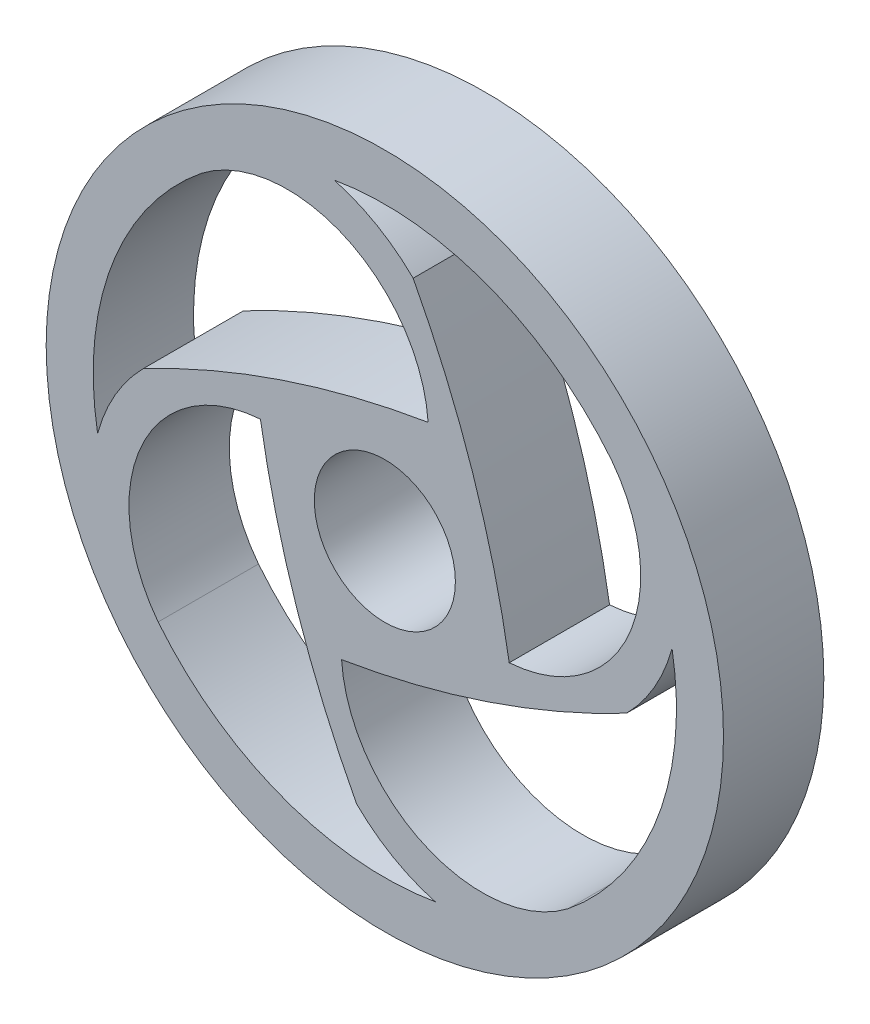
ISO-10303-21;
HEADER;
FILE_DESCRIPTION(('STEP AP214'),'2;1');
FILE_NAME('part.step','',(''),(''),'','','');
FILE_SCHEMA(('AUTOMOTIVE_DESIGN { 1 0 10303 214 1 1 1 1 }'));
ENDSEC;
DATA;
#1=APPLICATION_CONTEXT('core data for automotive mechanical design processes');
#2=APPLICATION_PROTOCOL_DEFINITION('international standard','automotive_design',2000,#1);
#3=PRODUCT_CONTEXT('',#1,'mechanical');
#4=PRODUCT('Part','Part','',(#3));
#5=PRODUCT_RELATED_PRODUCT_CATEGORY('part','',(#4));
#6=PRODUCT_DEFINITION_FORMATION('','',#4);
#7=PRODUCT_DEFINITION_CONTEXT('part definition',#1,'design');
#8=PRODUCT_DEFINITION('design','',#6,#7);
#9=PRODUCT_DEFINITION_SHAPE('','',#8);
#10=(LENGTH_UNIT() NAMED_UNIT(*) SI_UNIT(.MILLI.,.METRE.));
#11=(NAMED_UNIT(*) PLANE_ANGLE_UNIT() SI_UNIT($,.RADIAN.));
#12=(NAMED_UNIT(*) SI_UNIT($,.STERADIAN.) SOLID_ANGLE_UNIT());
#13=UNCERTAINTY_MEASURE_WITH_UNIT(LENGTH_MEASURE(1.E-05),#10,'distance_accuracy_value','');
#14=(GEOMETRIC_REPRESENTATION_CONTEXT(3) GLOBAL_UNCERTAINTY_ASSIGNED_CONTEXT((#13)) GLOBAL_UNIT_ASSIGNED_CONTEXT((#10,
#11,#12)) REPRESENTATION_CONTEXT('',''));
#15=CARTESIAN_POINT('',(0.,0.,0.));
#16=DIRECTION('',(0.,0.,1.));
#17=DIRECTION('',(1.,0.,0.));
#18=AXIS2_PLACEMENT_3D('',#15,#16,#17);
#19=CARTESIAN_POINT('',(-31.0957118066242,36.602722618068,32.));
#20=DIRECTION('',(0.,0.,-1.));
#21=DIRECTION('',(-1.,0.,0.));
#22=AXIS2_PLACEMENT_3D('',#19,#20,#21);
#23=CYLINDRICAL_SURFACE('',#22,45.);
#24=CARTESIAN_POINT('',(-31.0957118066242,36.602722618068,0.));
#25=DIRECTION('',(0.,0.,1.));
#26=DIRECTION('',(1.,0.,0.));
#27=AXIS2_PLACEMENT_3D('',#24,#25,#26);
#28=CIRCLE('',#27,45.);
#29=CARTESIAN_POINT('',(13.799753366446,39.6682090221535,0.));
#30=VERTEX_POINT('',#29);
#31=CARTESIAN_POINT('',(-58.5081427307582,72.2896758479192,0.));
#32=VERTEX_POINT('',#31);
#33=EDGE_CURVE('E248',#30,#32,#28,.T.);
#34=ORIENTED_EDGE('',*,*,#33,.F.);
#35=DIRECTION('',(0.,0.,-1.));
#36=VECTOR('',#35,1.);
#37=CARTESIAN_POINT('',(13.799753366446,39.6682090221535,32.));
#38=LINE('',#37,#36);
#39=CARTESIAN_POINT('',(13.799753366446,39.6682090221535,32.));
#40=VERTEX_POINT('',#39);
#41=EDGE_CURVE('E11',#40,#30,#38,.T.);
#42=ORIENTED_EDGE('',*,*,#41,.F.);
#43=CARTESIAN_POINT('',(-31.0957118066242,36.602722618068,32.));
#44=DIRECTION('',(0.,0.,1.));
#45=DIRECTION('',(1.,0.,0.));
#46=AXIS2_PLACEMENT_3D('',#43,#44,#45);
#47=CIRCLE('',#46,45.);
#48=CARTESIAN_POINT('',(-58.5081427307582,72.2896758479192,32.));
#49=VERTEX_POINT('',#48);
#50=EDGE_CURVE('E181',#40,#49,#47,.T.);
#51=ORIENTED_EDGE('',*,*,#50,.T.);
#52=DIRECTION('',(0.,0.,-1.));
#53=VECTOR('',#52,1.);
#54=CARTESIAN_POINT('',(-58.5081427307582,72.2896758479192,32.));
#55=LINE('',#54,#53);
#56=EDGE_CURVE('E59',#49,#32,#55,.T.);
#57=ORIENTED_EDGE('',*,*,#56,.T.);
#58=EDGE_LOOP('',(#34,#42,#51,#57));
#59=FACE_BOUND('',#58,.T.);
#60=ADVANCED_FACE('F39',(#59),#23,.F.);
#61=CARTESIAN_POINT('',(62.9548606400824,-256.277352574768,32.));
#62=DIRECTION('',(0.,0.,-1.));
#63=DIRECTION('',(-1.,0.,0.));
#64=AXIS2_PLACEMENT_3D('',#61,#62,#63);
#65=CYLINDRICAL_SURFACE('',#64,300.);
#66=CARTESIAN_POINT('',(62.9548606400824,-256.277352574768,0.));
#67=DIRECTION('',(0.,0.,1.));
#68=DIRECTION('',(1.,0.,0.));
#69=AXIS2_PLACEMENT_3D('',#66,#67,#68);
#70=CIRCLE('',#69,300.);
#71=CARTESIAN_POINT('',(-77.0845985108538,9.03180648445714,0.));
#72=VERTEX_POINT('',#71);
#73=EDGE_CURVE('E166',#72,#30,#70,.F.);
#74=ORIENTED_EDGE('',*,*,#73,.F.);
#75=DIRECTION('',(0.,0.,-1.));
#76=VECTOR('',#75,1.);
#77=CARTESIAN_POINT('',(-77.0845985108538,9.03180648445714,32.));
#78=LINE('',#77,#76);
#79=CARTESIAN_POINT('',(-77.0845985108538,9.03180648445714,32.));
#80=VERTEX_POINT('',#79);
#81=EDGE_CURVE('E50',#80,#72,#78,.T.);
#82=ORIENTED_EDGE('',*,*,#81,.F.);
#83=CARTESIAN_POINT('',(62.9548606400824,-256.277352574768,32.));
#84=DIRECTION('',(0.,0.,1.));
#85=DIRECTION('',(1.,0.,0.));
#86=AXIS2_PLACEMENT_3D('',#83,#84,#85);
#87=CIRCLE('',#86,300.);
#88=EDGE_CURVE('E164',#80,#40,#87,.F.);
#89=ORIENTED_EDGE('',*,*,#88,.T.);
#90=ORIENTED_EDGE('',*,*,#41,.T.);
#91=EDGE_LOOP('',(#74,#82,#89,#90));
#92=FACE_BOUND('',#91,.T.);
#93=ADVANCED_FACE('F162',(#92),#65,.T.);
#94=CARTESIAN_POINT('',(-36.6027226180679,-31.0957118066244,32.));
#95=DIRECTION('',(0.,0.,-1.));
#96=DIRECTION('',(-1.,0.,0.));
#97=AXIS2_PLACEMENT_3D('',#94,#95,#96);
#98=CYLINDRICAL_SURFACE('',#97,57.);
#99=CARTESIAN_POINT('',(-36.6027226180679,-31.0957118066244,0.));
#100=DIRECTION('',(0.,0.,1.));
#101=DIRECTION('',(1.,0.,0.));
#102=AXIS2_PLACEMENT_3D('',#99,#100,#101);
#103=CIRCLE('',#102,57.);
#104=CARTESIAN_POINT('',(-91.5954062888451,-16.1022217964289,0.));
#105=VERTEX_POINT('',#104);
#106=EDGE_CURVE('E253',#72,#105,#103,.T.);
#107=ORIENTED_EDGE('',*,*,#106,.T.);
#108=DIRECTION('',(0.,0.,-1.));
#109=VECTOR('',#108,1.);
#110=CARTESIAN_POINT('',(-91.5954062888451,-16.1022217964289,32.));
#111=LINE('',#110,#109);
#112=CARTESIAN_POINT('',(-91.5954062888451,-16.1022217964289,32.));
#113=VERTEX_POINT('',#112);
#114=EDGE_CURVE('E109',#113,#105,#111,.T.);
#115=ORIENTED_EDGE('',*,*,#114,.F.);
#116=CARTESIAN_POINT('',(-36.6027226180679,-31.0957118066244,32.));
#117=DIRECTION('',(0.,0.,1.));
#118=DIRECTION('',(1.,0.,0.));
#119=AXIS2_PLACEMENT_3D('',#116,#117,#118);
#120=CIRCLE('',#119,57.);
#121=EDGE_CURVE('E171',#80,#113,#120,.T.);
#122=ORIENTED_EDGE('',*,*,#121,.F.);
#123=ORIENTED_EDGE('',*,*,#81,.T.);
#124=EDGE_LOOP('',(#107,#115,#122,#123));
#125=FACE_BOUND('',#124,.T.);
#126=ADVANCED_FACE('F172',(#125),#98,.T.);
#127=CARTESIAN_POINT('',(0.,0.,32.));
#128=DIRECTION('',(0.,0.,-1.));
#129=DIRECTION('',(-1.,0.,0.));
#130=AXIS2_PLACEMENT_3D('',#127,#128,#129);
#131=CYLINDRICAL_SURFACE('',#130,93.);
#132=CARTESIAN_POINT('',(0.,0.,0.));
#133=DIRECTION('',(0.,0.,1.));
#134=DIRECTION('',(1.,0.,0.));
#135=AXIS2_PLACEMENT_3D('',#132,#133,#134);
#136=CIRCLE('',#135,93.);
#137=CARTESIAN_POINT('',(72.2896758479186,58.5081427307589,0.));
#138=VERTEX_POINT('',#137);
#139=CARTESIAN_POINT('',(-16.1022217964286,91.5954062888452,0.));
#140=VERTEX_POINT('',#139);
#141=EDGE_CURVE('E232',#138,#140,#136,.T.);
#142=ORIENTED_EDGE('',*,*,#141,.F.);
#143=DIRECTION('',(0.,0.,-1.));
#144=VECTOR('',#143,1.);
#145=CARTESIAN_POINT('',(72.2896758479186,58.5081427307589,32.));
#146=LINE('',#145,#144);
#147=CARTESIAN_POINT('',(72.2896758479186,58.5081427307589,32.));
#148=VERTEX_POINT('',#147);
#149=EDGE_CURVE('E271',#148,#138,#146,.T.);
#150=ORIENTED_EDGE('',*,*,#149,.F.);
#151=CARTESIAN_POINT('',(0.,0.,32.));
#152=DIRECTION('',(0.,0.,1.));
#153=DIRECTION('',(1.,0.,0.));
#154=AXIS2_PLACEMENT_3D('',#151,#152,#153);
#155=CIRCLE('',#154,93.);
#156=CARTESIAN_POINT('',(-16.1022217964286,91.5954062888452,32.));
#157=VERTEX_POINT('',#156);
#158=EDGE_CURVE('E350',#148,#157,#155,.T.);
#159=ORIENTED_EDGE('',*,*,#158,.T.);
#160=DIRECTION('',(0.,0.,-1.));
#161=VECTOR('',#160,1.);
#162=CARTESIAN_POINT('',(-16.1022217964286,91.5954062888452,32.));
#163=LINE('',#162,#161);
#164=EDGE_CURVE('E274',#157,#140,#163,.T.);
#165=ORIENTED_EDGE('',*,*,#164,.T.);
#166=EDGE_LOOP('',(#142,#150,#159,#165));
#167=FACE_BOUND('',#166,.T.);
#168=ADVANCED_FACE('F373',(#167),#131,.F.);
#169=CARTESIAN_POINT('',(36.6027226180677,31.0957118066246,32.));
#170=DIRECTION('',(0.,0.,-1.));
#171=DIRECTION('',(-1.,0.,0.));
#172=AXIS2_PLACEMENT_3D('',#169,#170,#171);
#173=CYLINDRICAL_SURFACE('',#172,45.);
#174=CARTESIAN_POINT('',(36.6027226180677,31.0957118066246,0.));
#175=DIRECTION('',(0.,0.,1.));
#176=DIRECTION('',(1.,0.,0.));
#177=AXIS2_PLACEMENT_3D('',#174,#175,#176);
#178=CIRCLE('',#177,45.);
#179=CARTESIAN_POINT('',(39.6682090221536,-13.7997533664457,0.));
#180=VERTEX_POINT('',#179);
#181=EDGE_CURVE('E236',#180,#138,#178,.T.);
#182=ORIENTED_EDGE('',*,*,#181,.F.);
#183=DIRECTION('',(0.,0.,-1.));
#184=VECTOR('',#183,1.);
#185=CARTESIAN_POINT('',(39.6682090221536,-13.7997533664457,32.));
#186=LINE('',#185,#184);
#187=CARTESIAN_POINT('',(39.6682090221536,-13.7997533664457,32.));
#188=VERTEX_POINT('',#187);
#189=EDGE_CURVE('E281',#188,#180,#186,.T.);
#190=ORIENTED_EDGE('',*,*,#189,.F.);
#191=CARTESIAN_POINT('',(36.6027226180677,31.0957118066246,32.));
#192=DIRECTION('',(0.,0.,1.));
#193=DIRECTION('',(1.,0.,0.));
#194=AXIS2_PLACEMENT_3D('',#191,#192,#193);
#195=CIRCLE('',#194,45.);
#196=EDGE_CURVE('E354',#188,#148,#195,.T.);
#197=ORIENTED_EDGE('',*,*,#196,.T.);
#198=ORIENTED_EDGE('',*,*,#149,.T.);
#199=EDGE_LOOP('',(#182,#190,#197,#198));
#200=FACE_BOUND('',#199,.T.);
#201=ADVANCED_FACE('F376',(#200),#173,.F.);
#202=CARTESIAN_POINT('',(-256.277352574767,-62.9548606400851,32.));
#203=DIRECTION('',(0.,0.,-1.));
#204=DIRECTION('',(-1.,0.,0.));
#205=AXIS2_PLACEMENT_3D('',#202,#203,#204);
#206=CYLINDRICAL_SURFACE('',#205,300.);
#207=CARTESIAN_POINT('',(-256.277352574767,-62.9548606400851,0.));
#208=DIRECTION('',(0.,0.,1.));
#209=DIRECTION('',(1.,0.,0.));
#210=AXIS2_PLACEMENT_3D('',#207,#208,#209);
#211=CIRCLE('',#210,300.);
#212=CARTESIAN_POINT('',(9.03180648445528,77.0845985108558,0.));
#213=VERTEX_POINT('',#212);
#214=EDGE_CURVE('E240',#213,#180,#211,.F.);
#215=ORIENTED_EDGE('',*,*,#214,.F.);
#216=DIRECTION('',(0.,0.,-1.));
#217=VECTOR('',#216,1.);
#218=CARTESIAN_POINT('',(9.03180648445528,77.0845985108558,32.));
#219=LINE('',#218,#217);
#220=CARTESIAN_POINT('',(9.03180648445528,77.0845985108558,32.));
#221=VERTEX_POINT('',#220);
#222=EDGE_CURVE('E277',#221,#213,#219,.T.);
#223=ORIENTED_EDGE('',*,*,#222,.F.);
#224=CARTESIAN_POINT('',(-256.277352574767,-62.9548606400851,32.));
#225=DIRECTION('',(0.,0.,1.));
#226=DIRECTION('',(1.,0.,0.));
#227=AXIS2_PLACEMENT_3D('',#224,#225,#226);
#228=CIRCLE('',#227,300.);
#229=EDGE_CURVE('E358',#221,#188,#228,.F.);
#230=ORIENTED_EDGE('',*,*,#229,.T.);
#231=ORIENTED_EDGE('',*,*,#189,.T.);
#232=EDGE_LOOP('',(#215,#223,#230,#231));
#233=FACE_BOUND('',#232,.T.);
#234=ADVANCED_FACE('F379',(#233),#206,.T.);
#235=CARTESIAN_POINT('',(0.,0.,32.));
#236=DIRECTION('',(0.,0.,-1.));
#237=DIRECTION('',(-1.,0.,0.));
#238=AXIS2_PLACEMENT_3D('',#235,#236,#237);
#239=CYLINDRICAL_SURFACE('',#238,93.);
#240=CARTESIAN_POINT('',(0.,0.,0.));
#241=DIRECTION('',(0.,0.,1.));
#242=DIRECTION('',(1.,0.,0.));
#243=AXIS2_PLACEMENT_3D('',#240,#241,#242);
#244=CIRCLE('',#243,93.);
#245=CARTESIAN_POINT('',(58.5081427307587,-72.2896758479188,0.));
#246=VERTEX_POINT('',#245);
#247=CARTESIAN_POINT('',(91.595406288845,16.1022217964296,0.));
#248=VERTEX_POINT('',#247);
#249=EDGE_CURVE('E216',#246,#248,#244,.T.);
#250=ORIENTED_EDGE('',*,*,#249,.F.);
#251=DIRECTION('',(0.,0.,-1.));
#252=VECTOR('',#251,1.);
#253=CARTESIAN_POINT('',(58.5081427307587,-72.2896758479188,32.));
#254=LINE('',#253,#252);
#255=CARTESIAN_POINT('',(58.5081427307587,-72.2896758479188,32.));
#256=VERTEX_POINT('',#255);
#257=EDGE_CURVE('E278',#256,#246,#254,.T.);
#258=ORIENTED_EDGE('',*,*,#257,.F.);
#259=CARTESIAN_POINT('',(0.,0.,32.));
#260=DIRECTION('',(0.,0.,1.));
#261=DIRECTION('',(1.,0.,0.));
#262=AXIS2_PLACEMENT_3D('',#259,#260,#261);
#263=CIRCLE('',#262,93.);
#264=CARTESIAN_POINT('',(91.595406288845,16.1022217964296,32.));
#265=VERTEX_POINT('',#264);
#266=EDGE_CURVE('E327',#256,#265,#263,.T.);
#267=ORIENTED_EDGE('',*,*,#266,.T.);
#268=DIRECTION('',(0.,0.,-1.));
#269=VECTOR('',#268,1.);
#270=CARTESIAN_POINT('',(91.595406288845,16.1022217964296,32.));
#271=LINE('',#270,#269);
#272=EDGE_CURVE('E286',#265,#248,#271,.T.);
#273=ORIENTED_EDGE('',*,*,#272,.T.);
#274=EDGE_LOOP('',(#250,#258,#267,#273));
#275=FACE_BOUND('',#274,.T.);
#276=ADVANCED_FACE('F415',(#275),#239,.F.);
#277=CARTESIAN_POINT('',(31.0957118066245,-36.6027226180678,32.));
#278=DIRECTION('',(0.,0.,-1.));
#279=DIRECTION('',(-1.,0.,0.));
#280=AXIS2_PLACEMENT_3D('',#277,#278,#279);
#281=CYLINDRICAL_SURFACE('',#280,45.);
#282=CARTESIAN_POINT('',(31.0957118066245,-36.6027226180678,0.));
#283=DIRECTION('',(0.,0.,1.));
#284=DIRECTION('',(1.,0.,0.));
#285=AXIS2_PLACEMENT_3D('',#282,#283,#284);
#286=CIRCLE('',#285,45.);
#287=CARTESIAN_POINT('',(-13.7997533664455,-39.6682090221536,0.));
#288=VERTEX_POINT('',#287);
#289=EDGE_CURVE('E220',#288,#246,#286,.T.);
#290=ORIENTED_EDGE('',*,*,#289,.F.);
#291=DIRECTION('',(0.,0.,-1.));
#292=VECTOR('',#291,1.);
#293=CARTESIAN_POINT('',(-13.7997533664455,-39.6682090221536,32.));
#294=LINE('',#293,#292);
#295=CARTESIAN_POINT('',(-13.7997533664455,-39.6682090221536,32.));
#296=VERTEX_POINT('',#295);
#297=EDGE_CURVE('E292',#296,#288,#294,.T.);
#298=ORIENTED_EDGE('',*,*,#297,.F.);
#299=CARTESIAN_POINT('',(31.0957118066245,-36.6027226180678,32.));
#300=DIRECTION('',(0.,0.,1.));
#301=DIRECTION('',(1.,0.,0.));
#302=AXIS2_PLACEMENT_3D('',#299,#300,#301);
#303=CIRCLE('',#302,45.);
#304=EDGE_CURVE('E339',#296,#256,#303,.T.);
#305=ORIENTED_EDGE('',*,*,#304,.T.);
#306=ORIENTED_EDGE('',*,*,#257,.T.);
#307=EDGE_LOOP('',(#290,#298,#305,#306));
#308=FACE_BOUND('',#307,.T.);
#309=ADVANCED_FACE('F426',(#308),#281,.F.);
#310=CARTESIAN_POINT('',(-62.9548606400842,256.277352574768,32.));
#311=DIRECTION('',(0.,0.,-1.));
#312=DIRECTION('',(-1.,0.,0.));
#313=AXIS2_PLACEMENT_3D('',#310,#311,#312);
#314=CYLINDRICAL_SURFACE('',#313,300.);
#315=CARTESIAN_POINT('',(-62.9548606400842,256.277352574768,0.));
#316=DIRECTION('',(0.,0.,1.));
#317=DIRECTION('',(1.,0.,0.));
#318=AXIS2_PLACEMENT_3D('',#315,#316,#317);
#319=CIRCLE('',#318,300.);
#320=CARTESIAN_POINT('',(77.0845985108537,-9.03180648445678,0.));
#321=VERTEX_POINT('',#320);
#322=EDGE_CURVE('E224',#321,#288,#319,.F.);
#323=ORIENTED_EDGE('',*,*,#322,.F.);
#324=DIRECTION('',(0.,0.,-1.));
#325=VECTOR('',#324,1.);
#326=CARTESIAN_POINT('',(77.0845985108537,-9.03180648445678,32.));
#327=LINE('',#326,#325);
#328=CARTESIAN_POINT('',(77.0845985108537,-9.03180648445678,32.));
#329=VERTEX_POINT('',#328);
#330=EDGE_CURVE('E289',#329,#321,#327,.T.);
#331=ORIENTED_EDGE('',*,*,#330,.F.);
#332=CARTESIAN_POINT('',(-62.9548606400842,256.277352574768,32.));
#333=DIRECTION('',(0.,0.,1.));
#334=DIRECTION('',(1.,0.,0.));
#335=AXIS2_PLACEMENT_3D('',#332,#333,#334);
#336=CIRCLE('',#335,300.);
#337=EDGE_CURVE('E343',#329,#296,#336,.F.);
#338=ORIENTED_EDGE('',*,*,#337,.T.);
#339=ORIENTED_EDGE('',*,*,#297,.T.);
#340=EDGE_LOOP('',(#323,#331,#338,#339));
#341=FACE_BOUND('',#340,.T.);
#342=ADVANCED_FACE('F423',(#341),#314,.T.);
#343=CARTESIAN_POINT('',(0.,0.,32.));
#344=DIRECTION('',(0.,0.,-1.));
#345=DIRECTION('',(-1.,0.,0.));
#346=AXIS2_PLACEMENT_3D('',#343,#344,#345);
#347=CYLINDRICAL_SURFACE('',#346,93.);
#348=CARTESIAN_POINT('',(0.,0.,0.));
#349=DIRECTION('',(0.,0.,1.));
#350=DIRECTION('',(1.,0.,0.));
#351=AXIS2_PLACEMENT_3D('',#348,#349,#350);
#352=CIRCLE('',#351,93.);
#353=CARTESIAN_POINT('',(-72.289675847919,-58.5081427307584,0.));
#354=VERTEX_POINT('',#353);
#355=CARTESIAN_POINT('',(16.1022217964292,-91.5954062888451,0.));
#356=VERTEX_POINT('',#355);
#357=EDGE_CURVE('E200',#354,#356,#352,.T.);
#358=ORIENTED_EDGE('',*,*,#357,.F.);
#359=DIRECTION('',(0.,0.,-1.));
#360=VECTOR('',#359,1.);
#361=CARTESIAN_POINT('',(-72.289675847919,-58.5081427307584,32.));
#362=LINE('',#361,#360);
#363=CARTESIAN_POINT('',(-72.289675847919,-58.5081427307584,32.));
#364=VERTEX_POINT('',#363);
#365=EDGE_CURVE('E43',#364,#354,#362,.T.);
#366=ORIENTED_EDGE('',*,*,#365,.F.);
#367=CARTESIAN_POINT('',(0.,0.,32.));
#368=DIRECTION('',(0.,0.,1.));
#369=DIRECTION('',(1.,0.,0.));
#370=AXIS2_PLACEMENT_3D('',#367,#368,#369);
#371=CIRCLE('',#370,93.);
#372=CARTESIAN_POINT('',(16.1022217964292,-91.5954062888451,32.));
#373=VERTEX_POINT('',#372);
#374=EDGE_CURVE('E268',#364,#373,#371,.T.);
#375=ORIENTED_EDGE('',*,*,#374,.T.);
#376=DIRECTION('',(0.,0.,-1.));
#377=VECTOR('',#376,1.);
#378=CARTESIAN_POINT('',(16.1022217964292,-91.5954062888451,32.));
#379=LINE('',#378,#377);
#380=EDGE_CURVE('E199',#373,#356,#379,.T.);
#381=ORIENTED_EDGE('',*,*,#380,.T.);
#382=EDGE_LOOP('',(#358,#366,#375,#381));
#383=FACE_BOUND('',#382,.T.);
#384=ADVANCED_FACE('F41',(#383),#347,.F.);
#385=CARTESIAN_POINT('',(-36.6027226180679,-31.0957118066244,32.));
#386=DIRECTION('',(0.,0.,-1.));
#387=DIRECTION('',(-1.,0.,0.));
#388=AXIS2_PLACEMENT_3D('',#385,#386,#387);
#389=CYLINDRICAL_SURFACE('',#388,45.);
#390=CARTESIAN_POINT('',(-36.6027226180679,-31.0957118066244,0.));
#391=DIRECTION('',(0.,0.,1.));
#392=DIRECTION('',(1.,0.,0.));
#393=AXIS2_PLACEMENT_3D('',#390,#391,#392);
#394=CIRCLE('',#393,45.);
#395=CARTESIAN_POINT('',(-39.6682090221537,13.7997533664459,0.));
#396=VERTEX_POINT('',#395);
#397=EDGE_CURVE('E204',#396,#354,#394,.T.);
#398=ORIENTED_EDGE('',*,*,#397,.F.);
#399=DIRECTION('',(0.,0.,-1.));
#400=VECTOR('',#399,1.);
#401=CARTESIAN_POINT('',(-39.6682090221537,13.7997533664459,32.));
#402=LINE('',#401,#400);
#403=CARTESIAN_POINT('',(-39.6682090221537,13.7997533664459,32.));
#404=VERTEX_POINT('',#403);
#405=EDGE_CURVE('E301',#404,#396,#402,.T.);
#406=ORIENTED_EDGE('',*,*,#405,.F.);
#407=CARTESIAN_POINT('',(-36.6027226180679,-31.0957118066244,32.));
#408=DIRECTION('',(0.,0.,1.));
#409=DIRECTION('',(1.,0.,0.));
#410=AXIS2_PLACEMENT_3D('',#407,#408,#409);
#411=CIRCLE('',#410,45.);
#412=EDGE_CURVE('E312',#404,#364,#411,.T.);
#413=ORIENTED_EDGE('',*,*,#412,.T.);
#414=ORIENTED_EDGE('',*,*,#365,.T.);
#415=EDGE_LOOP('',(#398,#406,#413,#414));
#416=FACE_BOUND('',#415,.T.);
#417=ADVANCED_FACE('F310',(#416),#389,.F.);
#418=CARTESIAN_POINT('',(256.277352574768,62.9548606400833,32.));
#419=DIRECTION('',(0.,0.,-1.));
#420=DIRECTION('',(-1.,0.,0.));
#421=AXIS2_PLACEMENT_3D('',#418,#419,#420);
#422=CYLINDRICAL_SURFACE('',#421,300.);
#423=CARTESIAN_POINT('',(256.277352574768,62.9548606400833,0.));
#424=DIRECTION('',(0.,0.,1.));
#425=DIRECTION('',(1.,0.,0.));
#426=AXIS2_PLACEMENT_3D('',#423,#424,#425);
#427=CIRCLE('',#426,300.);
#428=CARTESIAN_POINT('',(-9.03180648445713,-77.0845985108535,0.));
#429=VERTEX_POINT('',#428);
#430=EDGE_CURVE('E208',#429,#396,#427,.F.);
#431=ORIENTED_EDGE('',*,*,#430,.F.);
#432=DIRECTION('',(0.,0.,-1.));
#433=VECTOR('',#432,1.);
#434=CARTESIAN_POINT('',(-9.03180648445713,-77.0845985108535,32.));
#435=LINE('',#434,#433);
#436=CARTESIAN_POINT('',(-9.03180648445713,-77.0845985108535,32.));
#437=VERTEX_POINT('',#436);
#438=EDGE_CURVE('E299',#437,#429,#435,.T.);
#439=ORIENTED_EDGE('',*,*,#438,.F.);
#440=CARTESIAN_POINT('',(256.277352574768,62.9548606400833,32.));
#441=DIRECTION('',(0.,0.,1.));
#442=DIRECTION('',(1.,0.,0.));
#443=AXIS2_PLACEMENT_3D('',#440,#441,#442);
#444=CIRCLE('',#443,300.);
#445=EDGE_CURVE('E321',#437,#404,#444,.F.);
#446=ORIENTED_EDGE('',*,*,#445,.T.);
#447=ORIENTED_EDGE('',*,*,#405,.T.);
#448=EDGE_LOOP('',(#431,#439,#446,#447));
#449=FACE_BOUND('',#448,.T.);
#450=ADVANCED_FACE('F318',(#449),#422,.T.);
#451=CARTESIAN_POINT('',(0.,0.,32.));
#452=DIRECTION('',(0.,0.,-1.));
#453=DIRECTION('',(-1.,0.,0.));
#454=AXIS2_PLACEMENT_3D('',#451,#452,#453);
#455=CYLINDRICAL_SURFACE('',#454,22.5);
#456=CARTESIAN_POINT('',(0.,0.,32.));
#457=DIRECTION('',(0.,0.,1.));
#458=DIRECTION('',(1.,0.,0.));
#459=AXIS2_PLACEMENT_3D('',#456,#457,#458);
#460=CIRCLE('',#459,22.5);
#461=CARTESIAN_POINT('',(22.5,0.,32.));
#462=VERTEX_POINT('',#461);
#463=EDGE_CURVE('E191',#462,#462,#460,.T.);
#464=ORIENTED_EDGE('',*,*,#463,.T.);
#465=EDGE_LOOP('',(#464));
#466=FACE_BOUND('',#465,.T.);
#467=CARTESIAN_POINT('',(0.,0.,0.));
#468=DIRECTION('',(0.,0.,1.));
#469=DIRECTION('',(1.,0.,0.));
#470=AXIS2_PLACEMENT_3D('',#467,#468,#469);
#471=CIRCLE('',#470,22.5);
#472=CARTESIAN_POINT('',(22.5,0.,0.));
#473=VERTEX_POINT('',#472);
#474=EDGE_CURVE('E260',#473,#473,#471,.T.);
#475=ORIENTED_EDGE('',*,*,#474,.F.);
#476=EDGE_LOOP('',(#475));
#477=FACE_BOUND('',#476,.T.);
#478=ADVANCED_FACE('F435',(#466,#477),#455,.F.);
#479=CARTESIAN_POINT('',(0.,0.,32.));
#480=DIRECTION('',(0.,0.,-1.));
#481=DIRECTION('',(-1.,0.,0.));
#482=AXIS2_PLACEMENT_3D('',#479,#480,#481);
#483=CYLINDRICAL_SURFACE('',#482,93.);
#484=CARTESIAN_POINT('',(0.,0.,0.));
#485=DIRECTION('',(0.,0.,1.));
#486=DIRECTION('',(1.,0.,0.));
#487=AXIS2_PLACEMENT_3D('',#484,#485,#486);
#488=CIRCLE('',#487,93.);
#489=EDGE_CURVE('E256',#32,#105,#488,.T.);
#490=ORIENTED_EDGE('',*,*,#489,.F.);
#491=ORIENTED_EDGE('',*,*,#56,.F.);
#492=CARTESIAN_POINT('',(0.,0.,32.));
#493=DIRECTION('',(0.,0.,1.));
#494=DIRECTION('',(1.,0.,0.));
#495=AXIS2_PLACEMENT_3D('',#492,#493,#494);
#496=CIRCLE('',#495,93.);
#497=EDGE_CURVE('E176',#49,#113,#496,.T.);
#498=ORIENTED_EDGE('',*,*,#497,.T.);
#499=ORIENTED_EDGE('',*,*,#114,.T.);
#500=EDGE_LOOP('',(#490,#491,#498,#499));
#501=FACE_BOUND('',#500,.T.);
#502=ADVANCED_FACE('F412',(#501),#483,.F.);
#503=CARTESIAN_POINT('',(-31.0957118066242,36.602722618068,32.));
#504=DIRECTION('',(0.,0.,-1.));
#505=DIRECTION('',(-1.,0.,0.));
#506=AXIS2_PLACEMENT_3D('',#503,#504,#505);
#507=CYLINDRICAL_SURFACE('',#506,57.);
#508=CARTESIAN_POINT('',(-31.0957118066242,36.602722618068,0.));
#509=DIRECTION('',(0.,0.,1.));
#510=DIRECTION('',(1.,0.,0.));
#511=AXIS2_PLACEMENT_3D('',#508,#509,#510);
#512=CIRCLE('',#511,57.);
#513=EDGE_CURVE('E244',#213,#140,#512,.T.);
#514=ORIENTED_EDGE('',*,*,#513,.T.);
#515=ORIENTED_EDGE('',*,*,#164,.F.);
#516=CARTESIAN_POINT('',(-31.0957118066242,36.602722618068,32.));
#517=DIRECTION('',(0.,0.,1.));
#518=DIRECTION('',(1.,0.,0.));
#519=AXIS2_PLACEMENT_3D('',#516,#517,#518);
#520=CIRCLE('',#519,57.);
#521=EDGE_CURVE('E185',#221,#157,#520,.T.);
#522=ORIENTED_EDGE('',*,*,#521,.F.);
#523=ORIENTED_EDGE('',*,*,#222,.T.);
#524=EDGE_LOOP('',(#514,#515,#522,#523));
#525=FACE_BOUND('',#524,.T.);
#526=ADVANCED_FACE('F369',(#525),#507,.T.);
#527=CARTESIAN_POINT('',(36.6027226180677,31.0957118066246,32.));
#528=DIRECTION('',(0.,0.,-1.));
#529=DIRECTION('',(-1.,0.,0.));
#530=AXIS2_PLACEMENT_3D('',#527,#528,#529);
#531=CYLINDRICAL_SURFACE('',#530,57.);
#532=CARTESIAN_POINT('',(36.6027226180677,31.0957118066246,0.));
#533=DIRECTION('',(0.,0.,1.));
#534=DIRECTION('',(1.,0.,0.));
#535=AXIS2_PLACEMENT_3D('',#532,#533,#534);
#536=CIRCLE('',#535,57.);
#537=EDGE_CURVE('E228',#321,#248,#536,.T.);
#538=ORIENTED_EDGE('',*,*,#537,.T.);
#539=ORIENTED_EDGE('',*,*,#272,.F.);
#540=CARTESIAN_POINT('',(36.6027226180677,31.0957118066246,32.));
#541=DIRECTION('',(0.,0.,1.));
#542=DIRECTION('',(1.,0.,0.));
#543=AXIS2_PLACEMENT_3D('',#540,#541,#542);
#544=CIRCLE('',#543,57.);
#545=EDGE_CURVE('E347',#329,#265,#544,.T.);
#546=ORIENTED_EDGE('',*,*,#545,.F.);
#547=ORIENTED_EDGE('',*,*,#330,.T.);
#548=EDGE_LOOP('',(#538,#539,#546,#547));
#549=FACE_BOUND('',#548,.T.);
#550=ADVANCED_FACE('F398',(#549),#531,.T.);
#551=CARTESIAN_POINT('',(31.0957118066245,-36.6027226180678,32.));
#552=DIRECTION('',(0.,0.,-1.));
#553=DIRECTION('',(-1.,0.,0.));
#554=AXIS2_PLACEMENT_3D('',#551,#552,#553);
#555=CYLINDRICAL_SURFACE('',#554,57.);
#556=CARTESIAN_POINT('',(31.0957118066245,-36.6027226180678,0.));
#557=DIRECTION('',(0.,0.,1.));
#558=DIRECTION('',(1.,0.,0.));
#559=AXIS2_PLACEMENT_3D('',#556,#557,#558);
#560=CIRCLE('',#559,57.);
#561=EDGE_CURVE('E212',#429,#356,#560,.T.);
#562=ORIENTED_EDGE('',*,*,#561,.T.);
#563=ORIENTED_EDGE('',*,*,#380,.F.);
#564=CARTESIAN_POINT('',(31.0957118066245,-36.6027226180678,32.));
#565=DIRECTION('',(0.,0.,1.));
#566=DIRECTION('',(1.,0.,0.));
#567=AXIS2_PLACEMENT_3D('',#564,#565,#566);
#568=CIRCLE('',#567,57.);
#569=EDGE_CURVE('E323',#437,#373,#568,.T.);
#570=ORIENTED_EDGE('',*,*,#569,.F.);
#571=ORIENTED_EDGE('',*,*,#438,.T.);
#572=EDGE_LOOP('',(#562,#563,#570,#571));
#573=FACE_BOUND('',#572,.T.);
#574=ADVANCED_FACE('F324',(#573),#555,.T.);
#575=CARTESIAN_POINT('',(0.,0.,32.));
#576=DIRECTION('',(0.,0.,-1.));
#577=DIRECTION('',(-1.,0.,0.));
#578=AXIS2_PLACEMENT_3D('',#575,#576,#577);
#579=CYLINDRICAL_SURFACE('',#578,108.);
#580=CARTESIAN_POINT('',(0.,0.,32.));
#581=DIRECTION('',(0.,0.,1.));
#582=DIRECTION('',(1.,0.,0.));
#583=AXIS2_PLACEMENT_3D('',#580,#581,#582);
#584=CIRCLE('',#583,108.);
#585=CARTESIAN_POINT('',(108.,0.,32.));
#586=VERTEX_POINT('',#585);
#587=EDGE_CURVE('E195',#586,#586,#584,.T.);
#588=ORIENTED_EDGE('',*,*,#587,.F.);
#589=EDGE_LOOP('',(#588));
#590=FACE_BOUND('',#589,.T.);
#591=CARTESIAN_POINT('',(0.,0.,0.));
#592=DIRECTION('',(0.,0.,1.));
#593=DIRECTION('',(1.,0.,0.));
#594=AXIS2_PLACEMENT_3D('',#591,#592,#593);
#595=CIRCLE('',#594,108.);
#596=CARTESIAN_POINT('',(108.,0.,0.));
#597=VERTEX_POINT('',#596);
#598=EDGE_CURVE('E264',#597,#597,#595,.T.);
#599=ORIENTED_EDGE('',*,*,#598,.T.);
#600=EDGE_LOOP('',(#599));
#601=FACE_BOUND('',#600,.T.);
#602=ADVANCED_FACE('F389',(#590,#601),#579,.T.);
#603=CARTESIAN_POINT('',(0.,0.,32.));
#604=DIRECTION('',(0.,0.,1.));
#605=DIRECTION('',(1.,0.,0.));
#606=AXIS2_PLACEMENT_3D('',#603,#604,#605);
#607=PLANE('',#606);
#608=ORIENTED_EDGE('',*,*,#374,.F.);
#609=ORIENTED_EDGE('',*,*,#412,.F.);
#610=ORIENTED_EDGE('',*,*,#445,.F.);
#611=ORIENTED_EDGE('',*,*,#569,.T.);
#612=EDGE_LOOP('',(#608,#609,#610,#611));
#613=FACE_BOUND('',#612,.T.);
#614=ORIENTED_EDGE('',*,*,#266,.F.);
#615=ORIENTED_EDGE('',*,*,#304,.F.);
#616=ORIENTED_EDGE('',*,*,#337,.F.);
#617=ORIENTED_EDGE('',*,*,#545,.T.);
#618=EDGE_LOOP('',(#614,#615,#616,#617));
#619=FACE_BOUND('',#618,.T.);
#620=ORIENTED_EDGE('',*,*,#158,.F.);
#621=ORIENTED_EDGE('',*,*,#196,.F.);
#622=ORIENTED_EDGE('',*,*,#229,.F.);
#623=ORIENTED_EDGE('',*,*,#521,.T.);
#624=EDGE_LOOP('',(#620,#621,#622,#623));
#625=FACE_BOUND('',#624,.T.);
#626=ORIENTED_EDGE('',*,*,#50,.F.);
#627=ORIENTED_EDGE('',*,*,#88,.F.);
#628=ORIENTED_EDGE('',*,*,#121,.T.);
#629=ORIENTED_EDGE('',*,*,#497,.F.);
#630=EDGE_LOOP('',(#626,#627,#628,#629));
#631=FACE_BOUND('',#630,.T.);
#632=ORIENTED_EDGE('',*,*,#463,.F.);
#633=EDGE_LOOP('',(#632));
#634=FACE_BOUND('',#633,.T.);
#635=ORIENTED_EDGE('',*,*,#587,.T.);
#636=EDGE_LOOP('',(#635));
#637=FACE_BOUND('',#636,.T.);
#638=ADVANCED_FACE('F179',(#613,#619,#625,#631,#634,#637),#607,.T.);
#639=CARTESIAN_POINT('',(0.,0.,0.));
#640=DIRECTION('',(0.,0.,1.));
#641=DIRECTION('',(1.,0.,0.));
#642=AXIS2_PLACEMENT_3D('',#639,#640,#641);
#643=PLANE('',#642);
#644=ORIENTED_EDGE('',*,*,#357,.T.);
#645=ORIENTED_EDGE('',*,*,#561,.F.);
#646=ORIENTED_EDGE('',*,*,#430,.T.);
#647=ORIENTED_EDGE('',*,*,#397,.T.);
#648=EDGE_LOOP('',(#644,#645,#646,#647));
#649=FACE_BOUND('',#648,.T.);
#650=ORIENTED_EDGE('',*,*,#249,.T.);
#651=ORIENTED_EDGE('',*,*,#537,.F.);
#652=ORIENTED_EDGE('',*,*,#322,.T.);
#653=ORIENTED_EDGE('',*,*,#289,.T.);
#654=EDGE_LOOP('',(#650,#651,#652,#653));
#655=FACE_BOUND('',#654,.T.);
#656=ORIENTED_EDGE('',*,*,#141,.T.);
#657=ORIENTED_EDGE('',*,*,#513,.F.);
#658=ORIENTED_EDGE('',*,*,#214,.T.);
#659=ORIENTED_EDGE('',*,*,#181,.T.);
#660=EDGE_LOOP('',(#656,#657,#658,#659));
#661=FACE_BOUND('',#660,.T.);
#662=ORIENTED_EDGE('',*,*,#33,.T.);
#663=ORIENTED_EDGE('',*,*,#489,.T.);
#664=ORIENTED_EDGE('',*,*,#106,.F.);
#665=ORIENTED_EDGE('',*,*,#73,.T.);
#666=EDGE_LOOP('',(#662,#663,#664,#665));
#667=FACE_BOUND('',#666,.T.);
#668=ORIENTED_EDGE('',*,*,#474,.T.);
#669=EDGE_LOOP('',(#668));
#670=FACE_BOUND('',#669,.T.);
#671=ORIENTED_EDGE('',*,*,#598,.F.);
#672=EDGE_LOOP('',(#671));
#673=FACE_BOUND('',#672,.T.);
#674=ADVANCED_FACE('F316',(#649,#655,#661,#667,#670,#673),#643,.F.);
#675=CLOSED_SHELL('',(#60,#93,#126,#168,#201,#234,#276,#309,#342,#384,#417,#450,#478,#502,#526,
#550,#574,#602,#638,#674));
#676=MANIFOLD_SOLID_BREP('B2',#675);
#677=ADVANCED_BREP_SHAPE_REPRESENTATION('',(#18,#676),#14);
#678=SHAPE_DEFINITION_REPRESENTATION(#9,#677);
ENDSEC;
END-ISO-10303-21;
